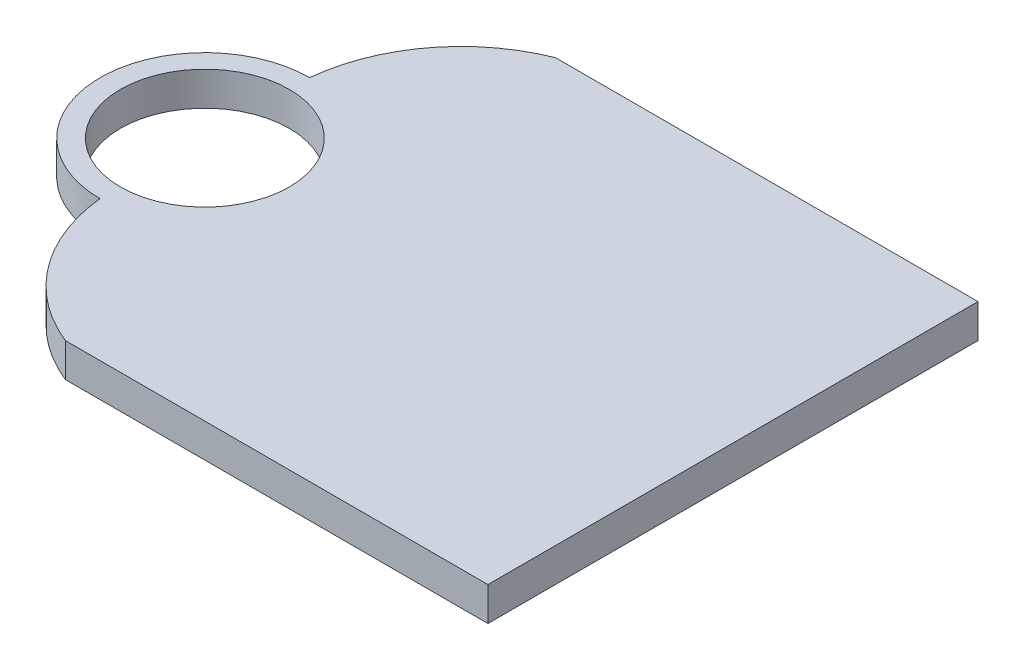
ISO-10303-21;
HEADER;
FILE_DESCRIPTION(('STEP AP214'),'2;1');
FILE_NAME('part.step','',(''),(''),'','','');
FILE_SCHEMA(('AUTOMOTIVE_DESIGN { 1 0 10303 214 1 1 1 1 }'));
ENDSEC;
DATA;
#1=APPLICATION_CONTEXT('core data for automotive mechanical design processes');
#2=APPLICATION_PROTOCOL_DEFINITION('international standard','automotive_design',2000,#1);
#3=PRODUCT_CONTEXT('',#1,'mechanical');
#4=PRODUCT('Part','Part','',(#3));
#5=PRODUCT_RELATED_PRODUCT_CATEGORY('part','',(#4));
#6=PRODUCT_DEFINITION_FORMATION('','',#4);
#7=PRODUCT_DEFINITION_CONTEXT('part definition',#1,'design');
#8=PRODUCT_DEFINITION('design','',#6,#7);
#9=PRODUCT_DEFINITION_SHAPE('','',#8);
#10=(LENGTH_UNIT() NAMED_UNIT(*) SI_UNIT(.MILLI.,.METRE.));
#11=(NAMED_UNIT(*) PLANE_ANGLE_UNIT() SI_UNIT($,.RADIAN.));
#12=(NAMED_UNIT(*) SI_UNIT($,.STERADIAN.) SOLID_ANGLE_UNIT());
#13=UNCERTAINTY_MEASURE_WITH_UNIT(LENGTH_MEASURE(1.E-05),#10,'distance_accuracy_value','');
#14=(GEOMETRIC_REPRESENTATION_CONTEXT(3) GLOBAL_UNCERTAINTY_ASSIGNED_CONTEXT((#13)) GLOBAL_UNIT_ASSIGNED_CONTEXT((#10,
#11,#12)) REPRESENTATION_CONTEXT('',''));
#15=CARTESIAN_POINT('',(0.,0.,0.));
#16=DIRECTION('',(0.,0.,1.));
#17=DIRECTION('',(1.,0.,0.));
#18=AXIS2_PLACEMENT_3D('',#15,#16,#17);
#19=CARTESIAN_POINT('',(19.9017550322479,-18.8220272611948,-10.4200639817411));
#20=DIRECTION('',(0.,-1.,0.));
#21=DIRECTION('',(1.,0.,0.));
#22=AXIS2_PLACEMENT_3D('',#19,#20,#21);
#23=CYLINDRICAL_SURFACE('',#22,20.);
#24=CARTESIAN_POINT('',(19.9017550322479,-22.8220272611948,-10.4200639817411));
#25=DIRECTION('',(0.,-1.,0.));
#26=DIRECTION('',(1.,0.,0.));
#27=AXIS2_PLACEMENT_3D('',#24,#25,#26);
#28=CIRCLE('',#27,20.);
#29=CARTESIAN_POINT('',(0.,-22.8220272611949,-12.4));
#30=VERTEX_POINT('',#29);
#31=CARTESIAN_POINT('',(12.5000000000001,-22.8220272611949,-29.));
#32=VERTEX_POINT('',#31);
#33=EDGE_CURVE('E127',#30,#32,#28,.T.);
#34=ORIENTED_EDGE('',*,*,#33,.F.);
#35=DIRECTION('',(0.,-1.,0.));
#36=VECTOR('',#35,1.);
#37=CARTESIAN_POINT('',(0.,-18.8220272611949,-12.4));
#38=LINE('',#37,#36);
#39=CARTESIAN_POINT('',(0.,-18.8220272611949,-12.4));
#40=VERTEX_POINT('',#39);
#41=EDGE_CURVE('E109',#40,#30,#38,.T.);
#42=ORIENTED_EDGE('',*,*,#41,.F.);
#43=CARTESIAN_POINT('',(19.9017550322479,-18.8220272611948,-10.4200639817411));
#44=DIRECTION('',(0.,-1.,0.));
#45=DIRECTION('',(1.,0.,0.));
#46=AXIS2_PLACEMENT_3D('',#43,#44,#45);
#47=CIRCLE('',#46,20.);
#48=CARTESIAN_POINT('',(12.5000000000001,-18.8220272611949,-29.));
#49=VERTEX_POINT('',#48);
#50=EDGE_CURVE('E148',#40,#49,#47,.T.);
#51=ORIENTED_EDGE('',*,*,#50,.T.);
#52=DIRECTION('',(0.,-1.,0.));
#53=VECTOR('',#52,1.);
#54=CARTESIAN_POINT('',(12.5000000000001,-18.8220272611949,-29.));
#55=LINE('',#54,#53);
#56=EDGE_CURVE('E129',#49,#32,#55,.T.);
#57=ORIENTED_EDGE('',*,*,#56,.T.);
#58=EDGE_LOOP('',(#34,#42,#51,#57));
#59=FACE_BOUND('',#58,.T.);
#60=ADVANCED_FACE('F60',(#59),#23,.T.);
#61=CARTESIAN_POINT('',(0.,-18.8220272611949,0.));
#62=DIRECTION('',(0.,-1.,0.));
#63=DIRECTION('',(1.,0.,0.));
#64=AXIS2_PLACEMENT_3D('',#61,#62,#63);
#65=CYLINDRICAL_SURFACE('',#64,12.4);
#66=CARTESIAN_POINT('',(0.,-22.8220272611949,0.));
#67=DIRECTION('',(0.,1.,0.));
#68=DIRECTION('',(-1.,0.,0.));
#69=AXIS2_PLACEMENT_3D('',#66,#67,#68);
#70=CIRCLE('',#69,12.4);
#71=CARTESIAN_POINT('',(0.,-22.8220272611949,12.4));
#72=VERTEX_POINT('',#71);
#73=EDGE_CURVE('E113',#30,#72,#70,.T.);
#74=ORIENTED_EDGE('',*,*,#73,.T.);
#75=DIRECTION('',(0.,-1.,0.));
#76=VECTOR('',#75,1.);
#77=CARTESIAN_POINT('',(0.,-18.8220272611949,12.4));
#78=LINE('',#77,#76);
#79=CARTESIAN_POINT('',(0.,-18.8220272611949,12.4));
#80=VERTEX_POINT('',#79);
#81=EDGE_CURVE('E159',#80,#72,#78,.T.);
#82=ORIENTED_EDGE('',*,*,#81,.F.);
#83=CARTESIAN_POINT('',(0.,-18.8220272611949,0.));
#84=DIRECTION('',(0.,1.,0.));
#85=DIRECTION('',(-1.,0.,0.));
#86=AXIS2_PLACEMENT_3D('',#83,#84,#85);
#87=CIRCLE('',#86,12.4);
#88=EDGE_CURVE('E115',#40,#80,#87,.T.);
#89=ORIENTED_EDGE('',*,*,#88,.F.);
#90=ORIENTED_EDGE('',*,*,#41,.T.);
#91=EDGE_LOOP('',(#74,#82,#89,#90));
#92=FACE_BOUND('',#91,.T.);
#93=ADVANCED_FACE('F111',(#92),#65,.T.);
#94=CARTESIAN_POINT('',(19.9017550322479,-18.8220272611948,10.4200639817411));
#95=DIRECTION('',(0.,-1.,0.));
#96=DIRECTION('',(1.,0.,0.));
#97=AXIS2_PLACEMENT_3D('',#94,#95,#96);
#98=CYLINDRICAL_SURFACE('',#97,20.);
#99=CARTESIAN_POINT('',(19.9017550322479,-22.8220272611948,10.4200639817411));
#100=DIRECTION('',(0.,1.,0.));
#101=DIRECTION('',(-1.,0.,0.));
#102=AXIS2_PLACEMENT_3D('',#99,#100,#101);
#103=CIRCLE('',#102,20.);
#104=CARTESIAN_POINT('',(12.5000000000001,-22.8220272611949,29.));
#105=VERTEX_POINT('',#104);
#106=EDGE_CURVE('E120',#72,#105,#103,.T.);
#107=ORIENTED_EDGE('',*,*,#106,.T.);
#108=DIRECTION('',(0.,-1.,0.));
#109=VECTOR('',#108,1.);
#110=CARTESIAN_POINT('',(12.5000000000001,-18.8220272611949,29.));
#111=LINE('',#110,#109);
#112=CARTESIAN_POINT('',(12.5000000000001,-18.8220272611949,29.));
#113=VERTEX_POINT('',#112);
#114=EDGE_CURVE('E155',#113,#105,#111,.T.);
#115=ORIENTED_EDGE('',*,*,#114,.F.);
#116=CARTESIAN_POINT('',(19.9017550322479,-18.8220272611948,10.4200639817411));
#117=DIRECTION('',(0.,1.,0.));
#118=DIRECTION('',(-1.,0.,0.));
#119=AXIS2_PLACEMENT_3D('',#116,#117,#118);
#120=CIRCLE('',#119,20.);
#121=EDGE_CURVE('E140',#80,#113,#120,.T.);
#122=ORIENTED_EDGE('',*,*,#121,.F.);
#123=ORIENTED_EDGE('',*,*,#81,.T.);
#124=EDGE_LOOP('',(#107,#115,#122,#123));
#125=FACE_BOUND('',#124,.T.);
#126=ADVANCED_FACE('F172',(#125),#98,.T.);
#127=CARTESIAN_POINT('',(12.5000000000001,-18.8220272611949,29.));
#128=DIRECTION('',(0.,0.,-1.));
#129=DIRECTION('',(-1.,0.,0.));
#130=AXIS2_PLACEMENT_3D('',#127,#128,#129);
#131=PLANE('',#130);
#132=DIRECTION('',(1.,0.,0.));
#133=VECTOR('',#132,1.);
#134=CARTESIAN_POINT('',(12.5000000000001,-22.8220272611949,29.));
#135=LINE('',#134,#133);
#136=CARTESIAN_POINT('',(62.5000000000001,-22.8220272611947,29.));
#137=VERTEX_POINT('',#136);
#138=EDGE_CURVE('E158',#105,#137,#135,.T.);
#139=ORIENTED_EDGE('',*,*,#138,.T.);
#140=DIRECTION('',(0.,-1.,0.));
#141=VECTOR('',#140,1.);
#142=CARTESIAN_POINT('',(62.5000000000001,-18.8220272611947,29.));
#143=LINE('',#142,#141);
#144=CARTESIAN_POINT('',(62.5000000000001,-18.8220272611947,29.));
#145=VERTEX_POINT('',#144);
#146=EDGE_CURVE('E147',#145,#137,#143,.T.);
#147=ORIENTED_EDGE('',*,*,#146,.F.);
#148=DIRECTION('',(1.,0.,0.));
#149=VECTOR('',#148,1.);
#150=CARTESIAN_POINT('',(12.5000000000001,-18.8220272611949,29.));
#151=LINE('',#150,#149);
#152=EDGE_CURVE('E135',#113,#145,#151,.T.);
#153=ORIENTED_EDGE('',*,*,#152,.F.);
#154=ORIENTED_EDGE('',*,*,#114,.T.);
#155=EDGE_LOOP('',(#139,#147,#153,#154));
#156=FACE_BOUND('',#155,.T.);
#157=ADVANCED_FACE('F175',(#156),#131,.F.);
#158=CARTESIAN_POINT('',(62.5000000000001,-18.8220272611947,29.));
#159=DIRECTION('',(-1.,0.,0.));
#160=DIRECTION('',(0.,-1.,0.));
#161=AXIS2_PLACEMENT_3D('',#158,#159,#160);
#162=PLANE('',#161);
#163=DIRECTION('',(0.,0.,-1.));
#164=VECTOR('',#163,1.);
#165=CARTESIAN_POINT('',(62.5000000000001,-22.8220272611947,29.));
#166=LINE('',#165,#164);
#167=CARTESIAN_POINT('',(62.5000000000001,-22.8220272611947,-29.));
#168=VERTEX_POINT('',#167);
#169=EDGE_CURVE('E154',#137,#168,#166,.T.);
#170=ORIENTED_EDGE('',*,*,#169,.T.);
#171=DIRECTION('',(0.,-1.,0.));
#172=VECTOR('',#171,1.);
#173=CARTESIAN_POINT('',(62.5000000000001,-18.8220272611947,-29.));
#174=LINE('',#173,#172);
#175=CARTESIAN_POINT('',(62.5000000000001,-18.8220272611947,-29.));
#176=VERTEX_POINT('',#175);
#177=EDGE_CURVE('E146',#176,#168,#174,.T.);
#178=ORIENTED_EDGE('',*,*,#177,.F.);
#179=DIRECTION('',(0.,0.,-1.));
#180=VECTOR('',#179,1.);
#181=CARTESIAN_POINT('',(62.5000000000001,-18.8220272611947,29.));
#182=LINE('',#181,#180);
#183=EDGE_CURVE('E77',#145,#176,#182,.T.);
#184=ORIENTED_EDGE('',*,*,#183,.F.);
#185=ORIENTED_EDGE('',*,*,#146,.T.);
#186=EDGE_LOOP('',(#170,#178,#184,#185));
#187=FACE_BOUND('',#186,.T.);
#188=ADVANCED_FACE('F165',(#187),#162,.F.);
#189=CARTESIAN_POINT('',(12.5000000000001,-18.8220272611949,-29.));
#190=DIRECTION('',(0.,0.,-1.));
#191=DIRECTION('',(-1.,0.,0.));
#192=AXIS2_PLACEMENT_3D('',#189,#190,#191);
#193=PLANE('',#192);
#194=DIRECTION('',(1.,0.,0.));
#195=VECTOR('',#194,1.);
#196=CARTESIAN_POINT('',(12.5000000000001,-22.8220272611949,-29.));
#197=LINE('',#196,#195);
#198=EDGE_CURVE('E70',#32,#168,#197,.T.);
#199=ORIENTED_EDGE('',*,*,#198,.F.);
#200=ORIENTED_EDGE('',*,*,#56,.F.);
#201=DIRECTION('',(1.,0.,0.));
#202=VECTOR('',#201,1.);
#203=CARTESIAN_POINT('',(12.5000000000001,-18.8220272611949,-29.));
#204=LINE('',#203,#202);
#205=EDGE_CURVE('E143',#49,#176,#204,.T.);
#206=ORIENTED_EDGE('',*,*,#205,.T.);
#207=ORIENTED_EDGE('',*,*,#177,.T.);
#208=EDGE_LOOP('',(#199,#200,#206,#207));
#209=FACE_BOUND('',#208,.T.);
#210=ADVANCED_FACE('F168',(#209),#193,.T.);
#211=CARTESIAN_POINT('',(19.9017550322479,-18.8220272611948,-10.4200639817411));
#212=DIRECTION('',(0.,-1.,0.));
#213=DIRECTION('',(1.,0.,0.));
#214=AXIS2_PLACEMENT_3D('',#211,#212,#213);
#215=PLANE('',#214);
#216=CARTESIAN_POINT('',(0.,-18.8220272611949,0.));
#217=DIRECTION('',(0.,1.,0.));
#218=DIRECTION('',(-1.,0.,0.));
#219=AXIS2_PLACEMENT_3D('',#216,#217,#218);
#220=CIRCLE('',#219,10.);
#221=CARTESIAN_POINT('',(-9.99999999999995,-18.8220272611949,0.));
#222=VERTEX_POINT('',#221);
#223=EDGE_CURVE('E64',#222,#222,#220,.F.);
#224=ORIENTED_EDGE('',*,*,#223,.T.);
#225=EDGE_LOOP('',(#224));
#226=FACE_BOUND('',#225,.T.);
#227=ORIENTED_EDGE('',*,*,#50,.F.);
#228=ORIENTED_EDGE('',*,*,#88,.T.);
#229=ORIENTED_EDGE('',*,*,#121,.T.);
#230=ORIENTED_EDGE('',*,*,#152,.T.);
#231=ORIENTED_EDGE('',*,*,#183,.T.);
#232=ORIENTED_EDGE('',*,*,#205,.F.);
#233=EDGE_LOOP('',(#227,#228,#229,#230,#231,#232));
#234=FACE_BOUND('',#233,.T.);
#235=ADVANCED_FACE('F62',(#226,#234),#215,.F.);
#236=CARTESIAN_POINT('',(19.9017550322479,-22.8220272611948,-10.4200639817411));
#237=DIRECTION('',(0.,-1.,0.));
#238=DIRECTION('',(1.,0.,0.));
#239=AXIS2_PLACEMENT_3D('',#236,#237,#238);
#240=PLANE('',#239);
#241=CARTESIAN_POINT('',(0.,-22.8220272611949,0.));
#242=DIRECTION('',(0.,1.,0.));
#243=DIRECTION('',(-1.,0.,0.));
#244=AXIS2_PLACEMENT_3D('',#241,#242,#243);
#245=CIRCLE('',#244,10.);
#246=CARTESIAN_POINT('',(-9.99999999999994,-22.8220272611949,0.));
#247=VERTEX_POINT('',#246);
#248=EDGE_CURVE('E12',#247,#247,#245,.F.);
#249=ORIENTED_EDGE('',*,*,#248,.F.);
#250=EDGE_LOOP('',(#249));
#251=FACE_BOUND('',#250,.T.);
#252=ORIENTED_EDGE('',*,*,#33,.T.);
#253=ORIENTED_EDGE('',*,*,#198,.T.);
#254=ORIENTED_EDGE('',*,*,#169,.F.);
#255=ORIENTED_EDGE('',*,*,#138,.F.);
#256=ORIENTED_EDGE('',*,*,#106,.F.);
#257=ORIENTED_EDGE('',*,*,#73,.F.);
#258=EDGE_LOOP('',(#252,#253,#254,#255,#256,#257));
#259=FACE_BOUND('',#258,.T.);
#260=ADVANCED_FACE('F125',(#251,#259),#240,.T.);
#261=CARTESIAN_POINT('',(0.,-18.8220272611949,0.));
#262=DIRECTION('',(0.,-1.,0.));
#263=DIRECTION('',(1.,0.,0.));
#264=AXIS2_PLACEMENT_3D('',#261,#262,#263);
#265=CYLINDRICAL_SURFACE('',#264,10.);
#266=ORIENTED_EDGE('',*,*,#223,.F.);
#267=EDGE_LOOP('',(#266));
#268=FACE_BOUND('',#267,.T.);
#269=ORIENTED_EDGE('',*,*,#248,.T.);
#270=EDGE_LOOP('',(#269));
#271=FACE_BOUND('',#270,.T.);
#272=ADVANCED_FACE('F199',(#268,#271),#265,.F.);
#273=CLOSED_SHELL('',(#60,#93,#126,#157,#188,#210,#235,#260,#272));
#274=MANIFOLD_SOLID_BREP('B2',#273);
#275=ADVANCED_BREP_SHAPE_REPRESENTATION('',(#18,#274),#14);
#276=SHAPE_DEFINITION_REPRESENTATION(#9,#275);
ENDSEC;
END-ISO-10303-21;
